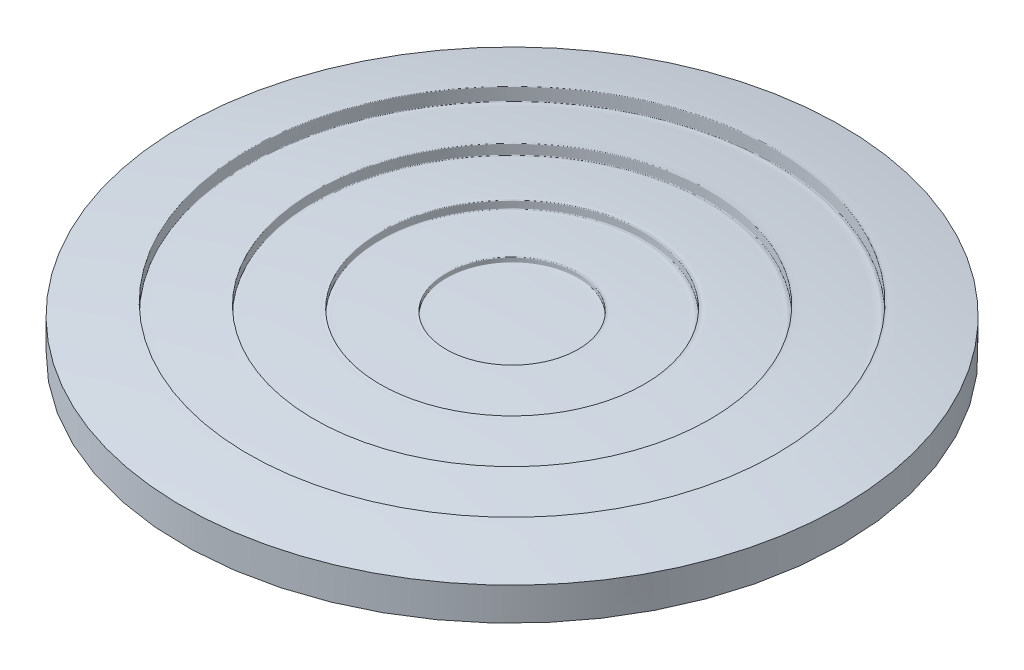
ISO-10303-21;
HEADER;
FILE_DESCRIPTION(('STEP AP214'),'2;1');
FILE_NAME('part.step','',(''),(''),'','','');
FILE_SCHEMA(('AUTOMOTIVE_DESIGN { 1 0 10303 214 1 1 1 1 }'));
ENDSEC;
DATA;
#1=APPLICATION_CONTEXT('core data for automotive mechanical design processes');
#2=APPLICATION_PROTOCOL_DEFINITION('international standard','automotive_design',2000,#1);
#3=PRODUCT_CONTEXT('',#1,'mechanical');
#4=PRODUCT('Part','Part','',(#3));
#5=PRODUCT_RELATED_PRODUCT_CATEGORY('part','',(#4));
#6=PRODUCT_DEFINITION_FORMATION('','',#4);
#7=PRODUCT_DEFINITION_CONTEXT('part definition',#1,'design');
#8=PRODUCT_DEFINITION('design','',#6,#7);
#9=PRODUCT_DEFINITION_SHAPE('','',#8);
#10=(LENGTH_UNIT() NAMED_UNIT(*) SI_UNIT(.MILLI.,.METRE.));
#11=(NAMED_UNIT(*) PLANE_ANGLE_UNIT() SI_UNIT($,.RADIAN.));
#12=(NAMED_UNIT(*) SI_UNIT($,.STERADIAN.) SOLID_ANGLE_UNIT());
#13=UNCERTAINTY_MEASURE_WITH_UNIT(LENGTH_MEASURE(1.E-05),#10,'distance_accuracy_value','');
#14=(GEOMETRIC_REPRESENTATION_CONTEXT(3) GLOBAL_UNCERTAINTY_ASSIGNED_CONTEXT((#13)) GLOBAL_UNIT_ASSIGNED_CONTEXT((#10,
#11,#12)) REPRESENTATION_CONTEXT('',''));
#15=CARTESIAN_POINT('',(0.,0.,0.));
#16=DIRECTION('',(0.,0.,1.));
#17=DIRECTION('',(1.,0.,0.));
#18=AXIS2_PLACEMENT_3D('',#15,#16,#17);
#19=CARTESIAN_POINT('',(0.,0.0800320256256271,0.));
#20=CARTESIAN_POINT('',(0.0333333388888907,0.0800224031163267,0.));
#21=CARTESIAN_POINT('',(0.100000050000078,0.0800031580881033,0.));
#22=CARTESIAN_POINT('',(0.333335055595431,0.0796399426848243,0.));
#23=CARTESIAN_POINT('',(0.833354308016764,0.0774085791698903,0.));
#24=CARTESIAN_POINT('',(1.73343939925626,0.0670388029785022,0.));
#25=CARTESIAN_POINT('',(2.50007575754089,0.0497933132257497,0.));
#26=CARTESIAN_POINT('',(3.03333701792726,0.0340545701563423,0.));
#27=CARTESIAN_POINT('',(3.16667395792778,0.0299156506388389,0.));
#28=CARTESIAN_POINT('',(3.29999644850655,0.0255892488481195,0.));
#29=CARTESIAN_POINT('',(3.40002112189424,0.0222117359958805,0.));
#30=CARTESIAN_POINT('',(3.49992927226332,0.0188553339296154,0.));
#31=CARTESIAN_POINT('',(3.60027231529087,0.0149460840771818,0.));
#32=CARTESIAN_POINT('',(3.69899222939183,0.012626094334583,0.));
#33=CARTESIAN_POINT('',(3.80377007878461,0.00390041795237991,0.));
#34=CARTESIAN_POINT('',(3.88593811925863,0.0186082386956518,0.));
#35=CARTESIAN_POINT('',(4.00251932676528,-0.0326474748212395,0.));
#36=CARTESIAN_POINT('',(3.99985957339306,0.0101461183815647,0.));
#37=CARTESIAN_POINT('',(4.00003762719593,0.0199608476976607,0.));
#38=CARTESIAN_POINT('',(3.99998991782324,0.0300104908277937,0.));
#39=CARTESIAN_POINT('',(4.00000270151112,0.0399971889911647,0.));
#40=CARTESIAN_POINT('',(3.99999356716753,0.066673360234852,0.));
#41=CARTESIAN_POINT('',(4.00000562715534,0.116660811431332,0.));
#42=CARTESIAN_POINT('',(3.99999935696263,0.170000669262229,0.));
#43=CARTESIAN_POINT('',(3.99999925127317,0.206667446191559,0.));
#44=CARTESIAN_POINT('',(4.00000108417028,0.219998871233554,0.));
#45=CARTESIAN_POINT('',(3.99999595382143,0.230004212613726,0.));
#46=CARTESIAN_POINT('',(4.00000902568422,0.236817809506566,0.));
#47=CARTESIAN_POINT('',(3.99990459188582,0.273781116711363,0.));
#48=CARTESIAN_POINT('',(4.11538868292364,0.220430032102882,0.));
#49=CARTESIAN_POINT('',(4.19587901047828,0.236582781398287,0.));
#50=CARTESIAN_POINT('',(4.30110700436611,0.226887527846934,0.));
#51=CARTESIAN_POINT('',(4.39970614106102,0.223991518340991,0.));
#52=CARTESIAN_POINT('',(4.50008158979314,0.219146376487593,0.));
#53=CARTESIAN_POINT('',(4.59998104560849,0.214696358381212,0.));
#54=CARTESIAN_POINT('',(4.70000805200802,0.21001326332983,0.));
#55=CARTESIAN_POINT('',(4.86667089390477,0.202099790017897,0.));
#56=CARTESIAN_POINT('',(5.20006120562527,0.185564011827986,0.));
#57=CARTESIAN_POINT('',(5.86687904884759,0.149515809179392,0.));
#58=CARTESIAN_POINT('',(6.50016037811513,0.109850799051308,0.));
#59=CARTESIAN_POINT('',(7.00001431050405,0.0752786920031973,0.));
#60=CARTESIAN_POINT('',(7.1666786627853,0.0634121876311082,0.));
#61=CARTESIAN_POINT('',(7.29999846735035,0.0537298867790473,0.));
#62=CARTESIAN_POINT('',(7.40002313742145,0.046333272970857,0.));
#63=CARTESIAN_POINT('',(7.49993129768834,0.0389620708900721,0.));
#64=CARTESIAN_POINT('',(7.60027432769242,0.0310188359276155,0.));
#65=CARTESIAN_POINT('',(7.69899421603215,0.024733408721133,0.));
#66=CARTESIAN_POINT('',(7.80377245445601,0.0117828388424013,0.));
#67=CARTESIAN_POINT('',(7.88593796488863,0.0232323308551218,0.));
#68=CARTESIAN_POINT('',(8.00251312435945,-0.0328279499222245,0.));
#69=CARTESIAN_POINT('',(7.99986021335863,0.010151411000899,0.));
#70=CARTESIAN_POINT('',(8.00003745571767,0.0199594295445827,0.));
#71=CARTESIAN_POINT('',(7.9999899637707,0.0300108708207657,0.));
#72=CARTESIAN_POINT('',(8.00000268919954,0.039997087172354,0.));
#73=CARTESIAN_POINT('',(7.99999359648386,0.066673602685587,0.));
#74=CARTESIAN_POINT('',(8.00000640185566,0.119993065779643,0.));
#75=CARTESIAN_POINT('',(7.9999947984923,0.216672300720686,0.));
#76=CARTESIAN_POINT('',(8.00000066989181,0.299999274116109,0.));
#77=CARTESIAN_POINT('',(8.00000072617776,0.356665879644324,0.));
#78=CARTESIAN_POINT('',(7.99999894848118,0.370001139622893,0.));
#79=CARTESIAN_POINT('',(8.00000392432166,0.379995746869461,0.));
#80=CARTESIAN_POINT('',(7.99998535423219,0.390015872899259,0.));
#81=CARTESIAN_POINT('',(8.00003640206175,0.397326276932549,0.));
#82=CARTESIAN_POINT('',(7.99955275693143,0.435324706447611,0.));
#83=CARTESIAN_POINT('',(8.11512874638758,0.377650420000375,0.));
#84=CARTESIAN_POINT('',(8.19595098477275,0.39025170860242,0.));
#85=CARTESIAN_POINT('',(8.30109035082512,0.37640521336943,0.));
#86=CARTESIAN_POINT('',(8.39971315413212,0.369518146074197,0.));
#87=CARTESIAN_POINT('',(8.50008228441555,0.360637926045001,0.));
#88=CARTESIAN_POINT('',(8.59998342836523,0.352163659346878,0.));
#89=CARTESIAN_POINT('',(8.70000998503604,0.34345239250634,0.));
#90=CARTESIAN_POINT('',(8.86667979396126,0.328824419609085,0.));
#91=CARTESIAN_POINT('',(9.20010378598105,0.29885019213163,0.));
#92=CARTESIAN_POINT('',(9.8670307357336,0.23589251422407,0.));
#93=CARTESIAN_POINT('',(10.5002605046131,0.170635085593399,0.));
#94=CARTESIAN_POINT('',(11.0000225113659,0.115834706953703,0.));
#95=CARTESIAN_POINT('',(11.1666834498269,0.0972169001755544,0.));
#96=CARTESIAN_POINT('',(11.3000005212368,0.0821318319161209,0.));
#97=CARTESIAN_POINT('',(11.4000251919465,0.0706802292551955,0.));
#98=CARTESIAN_POINT('',(11.4999333496536,0.0592580932059238,0.));
#99=CARTESIAN_POINT('',(11.6002764159185,0.0472432827825191,0.));
#100=CARTESIAN_POINT('',(11.6989960955114,0.0369578997727411,0.));
#101=CARTESIAN_POINT('',(11.8037754138726,0.0197340346386136,0.));
#102=CARTESIAN_POINT('',(11.8859357969435,0.0279263854098828,0.));
#103=CARTESIAN_POINT('',(12.0025027302565,-0.0330632175439528,0.));
#104=CARTESIAN_POINT('',(11.9998612834782,0.0101564475053698,0.));
#105=CARTESIAN_POINT('',(12.00003716898,0.0199580800172783,0.));
#106=CARTESIAN_POINT('',(11.9999900406018,0.030011232425517,0.));
#107=CARTESIAN_POINT('',(12.0000026686127,0.0399969902806537,0.));
#108=CARTESIAN_POINT('',(11.9999936455052,0.0666738334038919,0.));
#109=CARTESIAN_POINT('',(12.000006352847,0.119992835121168,0.));
#110=CARTESIAN_POINT('',(11.999993647153,0.22667383154548,0.));
#111=CARTESIAN_POINT('',(12.0000025881969,0.353330414308694,0.));
#112=CARTESIAN_POINT('',(11.9999997134232,0.456666990006584,0.));
#113=CARTESIAN_POINT('',(11.9999996208068,0.506667094579593,0.));
#114=CARTESIAN_POINT('',(12.0000005490788,0.519999380374176,0.));
#115=CARTESIAN_POINT('',(11.9999979508101,0.530002312475056,0.));
#116=CARTESIAN_POINT('',(12.0000076476807,0.539991369725597,0.));
#117=CARTESIAN_POINT('',(11.9999714584669,0.550032208622563,0.));
#118=CARTESIAN_POINT('',(12.0000871046317,0.558464281908792,0.));
#119=CARTESIAN_POINT('',(11.998665789287,0.598875461469171,0.));
#120=CARTESIAN_POINT('',(12.1146206722401,0.53707844272393,0.));
#121=CARTESIAN_POINT('',(12.1960895144119,0.54574341283072,0.));
#122=CARTESIAN_POINT('',(12.3010559112292,0.527797748310467,0.));
#123=CARTESIAN_POINT('',(12.3997249864654,0.516853985094926,0.));
#124=CARTESIAN_POINT('',(12.5000817404156,0.503903944758295,0.));
#125=CARTESIAN_POINT('',(12.5999861967533,0.491361765729551,0.));
#126=CARTESIAN_POINT('',(12.7000118690297,0.478580409444793,0.));
#127=CARTESIAN_POINT('',(12.8666889870073,0.45716564599781,0.));
#128=CARTESIAN_POINT('',(13.2001472240563,0.413603903792572,0.));
#129=CARTESIAN_POINT('',(13.9339965121944,0.31438612573347,0.));
#130=CARTESIAN_POINT('',(14.6004567066429,0.21773750387755,0.));
#131=CARTESIAN_POINT('',(15.1000073528423,0.141691348014834,0.));
#132=CARTESIAN_POINT('',(15.2000091733452,0.126362346725257,0.));
#133=CARTESIAN_POINT('',(15.3000026311831,0.110939604528143,0.));
#134=CARTESIAN_POINT('',(15.4000273064753,0.0953765593889158,0.));
#135=CARTESIAN_POINT('',(15.4999354493284,0.0798467942072145,0.));
#136=CARTESIAN_POINT('',(15.6002786009401,0.0637021030784441,0.));
#137=CARTESIAN_POINT('',(15.6989978888812,0.0493619689864648,0.));
#138=CARTESIAN_POINT('',(15.8037789811415,0.0277943476610746,0.));
#139=CARTESIAN_POINT('',(15.8859316164653,0.0327152271326993,0.));
#140=CARTESIAN_POINT('',(16.0024880960463,-0.0333552630248961,0.));
#141=CARTESIAN_POINT('',(15.9998627844484,0.0101611996174443,0.));
#142=CARTESIAN_POINT('',(16.0000367667962,0.0199568066926856,0.));
#143=CARTESIAN_POINT('',(15.9999901483666,0.0300115736118133,0.));
#144=CARTESIAN_POINT('',(16.0000026397372,0.0399968988600611,0.));
#145=CARTESIAN_POINT('',(15.9999937142635,0.0666740510944109,0.));
#146=CARTESIAN_POINT('',(16.0000062841066,0.119992617487093,0.));
#147=CARTESIAN_POINT('',(15.9999937158934,0.226674049179557,0.));
#148=CARTESIAN_POINT('',(16.0000060513618,0.403326224246845,0.));
#149=CARTESIAN_POINT('',(15.9999997142115,0.56000033575359,0.));
#150=CARTESIAN_POINT('',(16.0000000947731,0.66666655526812,0.));
#151=CARTESIAN_POINT('',(16.0000007161128,0.686665824885087,0.));
#152=CARTESIAN_POINT('',(15.9999989630555,0.700001218915281,0.));
#153=CARTESIAN_POINT('',(16.0000038699296,0.709995450946242,0.));
#154=CARTESIAN_POINT('',(15.9999855572259,0.720016977299753,0.));
#155=CARTESIAN_POINT('',(16.0000359306348,0.727328338222018,0.));
#156=CARTESIAN_POINT('',(15.9995538477609,0.765703409494801,0.));
#157=CARTESIAN_POINT('',(16.1151359211458,0.698089918070392,0.));
#158=CARTESIAN_POINT('',(16.1959538652337,0.704266578960156,0.));
#159=CARTESIAN_POINT('',(16.3010950322391,0.681756189670854,0.));
#160=CARTESIAN_POINT('',(16.3997171835658,0.666802377717466,0.));
#161=CARTESIAN_POINT('',(16.5000865390643,0.649691197013248,0.));
#162=CARTESIAN_POINT('',(16.5999876142325,0.633026079866625,0.));
#163=CARTESIAN_POINT('',(16.7000141967577,0.616109194566969,0.));
#164=CARTESIAN_POINT('',(16.8666980422371,0.587801463058516,0.));
#165=CARTESIAN_POINT('',(17.2001925127253,0.53043149130021,0.));
#166=CARTESIAN_POINT('',(17.8673465777863,0.412560598194657,0.));
#167=CARTESIAN_POINT('',(18.6674647266385,0.264034037589311,0.));
#168=CARTESIAN_POINT('',(19.3335574501953,0.134073620379225,0.));
#169=CARTESIAN_POINT('',(19.6666907039317,0.0674884636436023,0.));
#170=CARTESIAN_POINT('',(19.800010054853,0.0406266833839346,0.));
#171=CARTESIAN_POINT('',(19.9000112902618,0.0203794284991258,0.));
#172=CARTESIAN_POINT('',(19.9666681281416,0.00679361200939062,0.));
#173=CARTESIAN_POINT('',(20.,0.,0.));
#174=B_SPLINE_CURVE_WITH_KNOTS('',3,(#19,#20,#21,#22,#23,#24,#25,#26,#27,#28,#29,#30,#31,#32,
#33,#34,#35,#36,#37,#38,#39,#40,#41,#42,#43,#44,#45,#46,#47,#48,#49,#50,#51,#52,#53,#54,#55,#56,
#57,#58,#59,#60,#61,#62,#63,#64,#65,#66,#67,#68,#69,#70,#71,#72,#73,#74,#75,#76,#77,#78,#79,#80,
#81,#82,#83,#84,#85,#86,#87,#88,#89,#90,#91,#92,#93,#94,#95,#96,#97,#98,#99,#100,#101,#102,#103,
#104,#105,#106,#107,#108,#109,#110,#111,#112,#113,#114,#115,#116,#117,#118,#119,#120,#121,#122,
#123,#124,#125,#126,#127,#128,#129,#130,#131,#132,#133,#134,#135,#136,#137,#138,#139,#140,#141,
#142,#143,#144,#145,#146,#147,#148,#149,#150,#151,#152,#153,#154,#155,#156,#157,#158,#159,#160,
#161,#162,#163,#164,#165,#166,#167,#168,#169,#170,#171,#172,#173),.UNSPECIFIED.,.F.,.F.,(4,1,1,
1,1,1,1,1,1,1,1,1,1,1,1,1,1,1,1,1,1,1,1,1,1,1,1,1,1,1,1,1,1,1,1,1,1,1,1,1,1,1,1,1,1,1,1,1,1,1,1,
1,1,1,1,1,1,1,1,1,1,1,1,1,1,1,1,1,1,1,1,1,1,1,1,1,1,1,1,1,1,1,1,1,1,1,1,1,1,1,1,1,1,1,1,1,1,1,1,
1,1,1,1,1,1,1,1,1,1,1,1,1,1,1,1,1,1,1,1,1,1,1,1,1,1,1,1,1,1,1,1,1,1,1,1,1,1,1,1,1,1,1,1,1,1,1,1,
1,1,1,1,1,4),(0.,0.00452977191256949,0.00905954835491995,0.0317086570608578,0.0724794312015268,
0.131381783305673,0.135913526956663,0.144977427038083,0.149509592567331,0.15404190782364,
0.158574377359715,0.163107005729654,0.16763979748899,0.172172757194731,0.176705889405402,
0.181239198681087,0.181692175815722,0.182145152950356,0.182598130084991,0.183051107219626,
0.183504084354261,0.186221947162069,0.189845764239147,0.190751718508417,0.191204695643052,
0.191657672777687,0.192110649912321,0.192132466167974,0.196665957070356,0.201199634162761,
0.205733502010197,0.210267565179397,0.214801828238863,0.219336295758901,0.223870972311672,
0.228405862471225,0.24201186036034,0.269230241921235,0.319155585664565,0.328236773075507,
0.337319238205846,0.341860961498022,0.346403018124671,0.350945412726941,0.355488149949064,
0.360031234438403,0.364574670845494,0.369118463824092,0.373662618031213,0.374115595165848,
0.374568572300483,0.375021549435118,0.375474526569753,0.375927503704387,0.378645366512196,
0.382722160723909,0.389063840608796,0.389969794878065,0.3904227720127,0.390875749147335,
0.391328726281969,0.391781703416604,0.391876701196488,0.396421221292455,0.400966111940939,
0.405511377809006,0.410057023567161,0.414603053889389,0.419149473453204,0.423696286939692,
0.428243499033554,0.441887573861572,0.46918712003346,0.519278696832481,0.528392543305511,
0.537508419613694,0.542067130921788,0.546626364057223,0.551186123819564,0.555746415013287,
0.56030724244782,0.564868610937596,0.569430525302099,0.573992990365912,0.574445967500547,
0.574898944635182,0.575351921769817,0.575804898904451,0.576257876039086,0.578975738846895,
0.583052533058607,0.590753144347398,0.596188869963016,0.597094824232285,0.59754780136692,
0.598000778501555,0.598453755636189,0.598906732770824,0.599359709905459,0.599617351246023,
0.604180371838877,0.608743952795701,0.613308098956666,0.617872815167239,0.622438106278229,
0.627003977145837,0.631570432631704,0.636137477602962,0.649842198183791,0.677268215045202,
0.736771530590141,0.741353490431021,0.745936158346473,0.750519539357369,0.755103638491412,
0.759688460783189,0.764274011274222,0.768860295013022,0.773447317055148,0.778035082463257,
0.78262359630716,0.783076573441795,0.78352955057643,0.783982527711065,0.784435504845699,
0.784888481980334,0.787606344788143,0.791683138999856,0.799383750288647,0.811614132923785,
0.81297306432769,0.813879018596959,0.814331995731594,0.814784972866229,0.815237950000863,
0.815690927135498,0.81578658334516,0.820375850701879,0.8249658766557,0.829556666298228,
0.834148224728443,0.83874055705276,0.843333668385076,0.847927563846837,0.852522248567084,
0.866311089684366,0.893910777808532,0.944589655714018,0.97689603530413,0.986134774921156,
0.990755562466462,0.995377302358283,1.),.UNSPECIFIED.);
#175=CARTESIAN_POINT('',(3.43024899888577E-12,-1000.,0.));
#176=DIRECTION('',(0.,-1.,0.));
#177=AXIS1_PLACEMENT('',#175,#176);
#178=SURFACE_OF_REVOLUTION('',#174,#177);
#179=CARTESIAN_POINT('',(0.,-1.11022302462516E-13,0.));
#180=DIRECTION('',(0.,-1.,0.));
#181=DIRECTION('',(1.,0.,0.));
#182=AXIS2_PLACEMENT_3D('',#179,#180,#181);
#183=CIRCLE('',#182,20.);
#184=CARTESIAN_POINT('',(20.,0.,0.));
#185=VERTEX_POINT('',#184);
#186=EDGE_CURVE('E47',#185,#185,#183,.T.);
#187=ORIENTED_EDGE('',*,*,#186,.F.);
#188=EDGE_LOOP('',(#187));
#189=FACE_BOUND('',#188,.T.);
#190=CARTESIAN_POINT('',(0.,0.0800320256256271,0.));
#191=VERTEX_POINT('',#190);
#192=VERTEX_LOOP('',#191);
#193=FACE_BOUND('',#192,.T.);
#194=ADVANCED_FACE('F39',(#189,#193),#178,.T.);
#195=CARTESIAN_POINT('',(0.,-2.00000000000242,0.));
#196=DIRECTION('',(0.,-1.,0.));
#197=DIRECTION('',(1.,0.,0.));
#198=AXIS2_PLACEMENT_3D('',#195,#196,#197);
#199=PLANE('',#198);
#200=CARTESIAN_POINT('',(0.,-2.00000000000011,0.));
#201=DIRECTION('',(0.,-1.,0.));
#202=DIRECTION('',(1.,0.,0.));
#203=AXIS2_PLACEMENT_3D('',#200,#201,#202);
#204=CIRCLE('',#203,20.);
#205=CARTESIAN_POINT('',(20.,-2.00000000000004,0.));
#206=VERTEX_POINT('',#205);
#207=EDGE_CURVE('E11',#206,#206,#204,.T.);
#208=ORIENTED_EDGE('',*,*,#207,.T.);
#209=EDGE_LOOP('',(#208));
#210=FACE_BOUND('',#209,.T.);
#211=ADVANCED_FACE('F51',(#210),#199,.T.);
#212=CARTESIAN_POINT('',(3.43024899888577E-12,-1000.,0.));
#213=DIRECTION('',(0.,-1.,0.));
#214=DIRECTION('',(1.,0.,0.));
#215=AXIS2_PLACEMENT_3D('',#212,#213,#214);
#216=CYLINDRICAL_SURFACE('',#215,20.);
#217=ORIENTED_EDGE('',*,*,#207,.F.);
#218=EDGE_LOOP('',(#217));
#219=FACE_BOUND('',#218,.T.);
#220=ORIENTED_EDGE('',*,*,#186,.T.);
#221=EDGE_LOOP('',(#220));
#222=FACE_BOUND('',#221,.T.);
#223=ADVANCED_FACE('F56',(#219,#222),#216,.T.);
#224=CLOSED_SHELL('',(#194,#211,#223));
#225=MANIFOLD_SOLID_BREP('B2',#224);
#226=ADVANCED_BREP_SHAPE_REPRESENTATION('',(#18,#225),#14);
#227=SHAPE_DEFINITION_REPRESENTATION(#9,#226);
ENDSEC;
END-ISO-10303-21;
